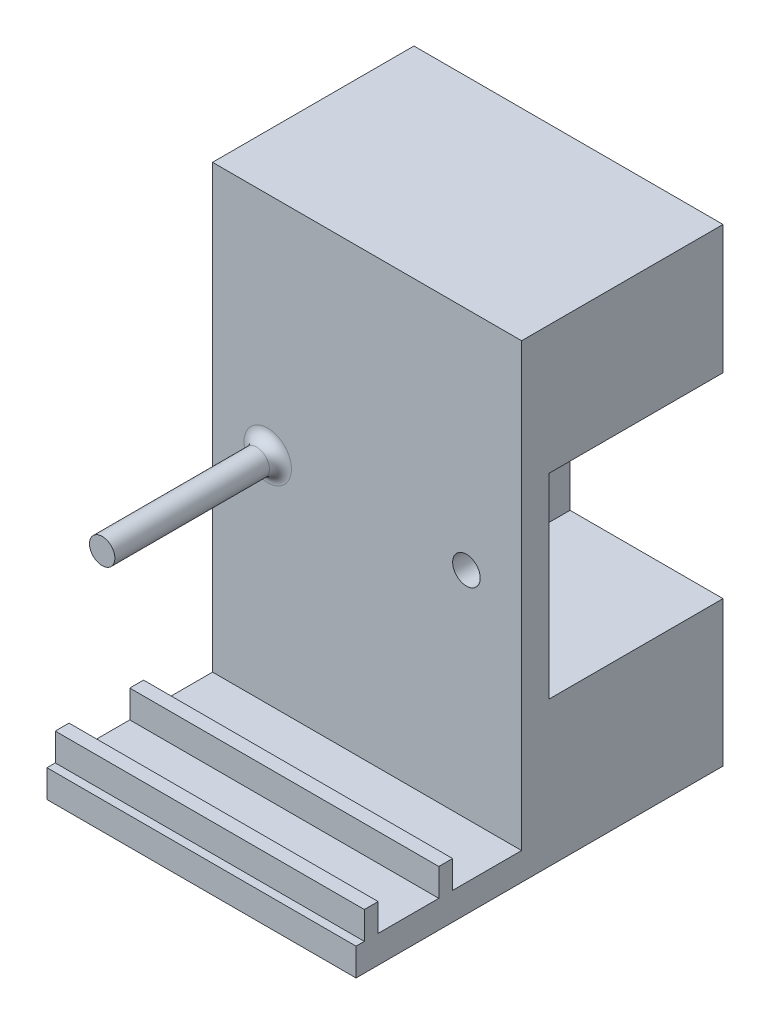
ISO-10303-21;
HEADER;
FILE_DESCRIPTION(('STEP AP214'),'2;1');
FILE_NAME('part.step','',(''),(''),'','','');
FILE_SCHEMA(('AUTOMOTIVE_DESIGN { 1 0 10303 214 1 1 1 1 }'));
ENDSEC;
DATA;
#1=APPLICATION_CONTEXT('core data for automotive mechanical design processes');
#2=APPLICATION_PROTOCOL_DEFINITION('international standard','automotive_design',2000,#1);
#3=PRODUCT_CONTEXT('',#1,'mechanical');
#4=PRODUCT('Part','Part','',(#3));
#5=PRODUCT_RELATED_PRODUCT_CATEGORY('part','',(#4));
#6=PRODUCT_DEFINITION_FORMATION('','',#4);
#7=PRODUCT_DEFINITION_CONTEXT('part definition',#1,'design');
#8=PRODUCT_DEFINITION('design','',#6,#7);
#9=PRODUCT_DEFINITION_SHAPE('','',#8);
#10=(LENGTH_UNIT() NAMED_UNIT(*) SI_UNIT(.MILLI.,.METRE.));
#11=(NAMED_UNIT(*) PLANE_ANGLE_UNIT() SI_UNIT($,.RADIAN.));
#12=(NAMED_UNIT(*) SI_UNIT($,.STERADIAN.) SOLID_ANGLE_UNIT());
#13=UNCERTAINTY_MEASURE_WITH_UNIT(LENGTH_MEASURE(1.E-05),#10,'distance_accuracy_value','');
#14=(GEOMETRIC_REPRESENTATION_CONTEXT(3) GLOBAL_UNCERTAINTY_ASSIGNED_CONTEXT((#13)) GLOBAL_UNIT_ASSIGNED_CONTEXT((#10,
#11,#12)) REPRESENTATION_CONTEXT('',''));
#15=CARTESIAN_POINT('',(0.,0.,0.));
#16=DIRECTION('',(0.,0.,1.));
#17=DIRECTION('',(1.,0.,0.));
#18=AXIS2_PLACEMENT_3D('',#15,#16,#17);
#19=CARTESIAN_POINT('',(-35.56,-50.8,-40.));
#20=DIRECTION('',(0.,-1.,0.));
#21=DIRECTION('',(0.,0.,-1.));
#22=AXIS2_PLACEMENT_3D('',#19,#20,#21);
#23=PLANE('',#22);
#24=DIRECTION('',(1.,0.,0.));
#25=VECTOR('',#24,1.);
#26=CARTESIAN_POINT('',(-35.5599999999996,-50.8,42.545));
#27=LINE('',#26,#25);
#28=CARTESIAN_POINT('',(-35.5599999999996,-50.8,42.545));
#29=VERTEX_POINT('',#28);
#30=CARTESIAN_POINT('',(35.56,-50.8,42.545));
#31=VERTEX_POINT('',#30);
#32=EDGE_CURVE('E365',#29,#31,#27,.T.);
#33=ORIENTED_EDGE('',*,*,#32,.F.);
#34=DIRECTION('',(0.,0.,1.));
#35=VECTOR('',#34,1.);
#36=CARTESIAN_POINT('',(-35.56,-50.8,-40.));
#37=LINE('',#36,#35);
#38=CARTESIAN_POINT('',(-35.56,-50.8,44.45));
#39=VERTEX_POINT('',#38);
#40=EDGE_CURVE('E185',#29,#39,#37,.T.);
#41=ORIENTED_EDGE('',*,*,#40,.T.);
#42=DIRECTION('',(1.,0.,0.));
#43=VECTOR('',#42,1.);
#44=CARTESIAN_POINT('',(-35.56,-50.8,44.45));
#45=LINE('',#44,#43);
#46=CARTESIAN_POINT('',(35.56,-50.8,44.45));
#47=VERTEX_POINT('',#46);
#48=EDGE_CURVE('E226',#39,#47,#45,.T.);
#49=ORIENTED_EDGE('',*,*,#48,.T.);
#50=DIRECTION('',(0.,0.,1.));
#51=VECTOR('',#50,1.);
#52=CARTESIAN_POINT('',(35.56,-50.8,-40.));
#53=LINE('',#52,#51);
#54=EDGE_CURVE('E240',#31,#47,#53,.T.);
#55=ORIENTED_EDGE('',*,*,#54,.F.);
#56=EDGE_LOOP('',(#33,#41,#49,#55));
#57=FACE_BOUND('',#56,.T.);
#58=ADVANCED_FACE('F38',(#57),#23,.F.);
#59=DIRECTION('',(-1.,0.,0.));
#60=VECTOR('',#59,1.);
#61=CARTESIAN_POINT('',(-35.5599999999996,-50.8,39.37));
#62=LINE('',#61,#60);
#63=CARTESIAN_POINT('',(35.56,-50.8,39.37));
#64=VERTEX_POINT('',#63);
#65=CARTESIAN_POINT('',(-35.5599999999996,-50.8,39.37));
#66=VERTEX_POINT('',#65);
#67=EDGE_CURVE('E180',#64,#66,#62,.T.);
#68=ORIENTED_EDGE('',*,*,#67,.F.);
#69=CARTESIAN_POINT('',(35.56,-50.8,25.4));
#70=VERTEX_POINT('',#69);
#71=EDGE_CURVE('E61',#70,#64,#53,.T.);
#72=ORIENTED_EDGE('',*,*,#71,.F.);
#73=DIRECTION('',(1.,0.,0.));
#74=VECTOR('',#73,1.);
#75=CARTESIAN_POINT('',(-35.56,-50.8,25.4));
#76=LINE('',#75,#74);
#77=CARTESIAN_POINT('',(-35.56,-50.8,25.4));
#78=VERTEX_POINT('',#77);
#79=EDGE_CURVE('E186',#78,#70,#76,.T.);
#80=ORIENTED_EDGE('',*,*,#79,.F.);
#81=EDGE_CURVE('E236',#78,#66,#37,.T.);
#82=ORIENTED_EDGE('',*,*,#81,.T.);
#83=EDGE_LOOP('',(#68,#72,#80,#82));
#84=FACE_BOUND('',#83,.T.);
#85=ADVANCED_FACE('F327',(#84),#23,.F.);
#86=DIRECTION('',(-1.,0.,0.));
#87=VECTOR('',#86,1.);
#88=CARTESIAN_POINT('',(-35.56,-50.8,22.225));
#89=LINE('',#88,#87);
#90=CARTESIAN_POINT('',(35.56,-50.8,22.225));
#91=VERTEX_POINT('',#90);
#92=CARTESIAN_POINT('',(-35.56,-50.8,22.225));
#93=VERTEX_POINT('',#92);
#94=EDGE_CURVE('E188',#91,#93,#89,.T.);
#95=ORIENTED_EDGE('',*,*,#94,.F.);
#96=CARTESIAN_POINT('',(35.56,-50.8,6.35));
#97=VERTEX_POINT('',#96);
#98=EDGE_CURVE('E237',#97,#91,#53,.T.);
#99=ORIENTED_EDGE('',*,*,#98,.F.);
#100=DIRECTION('',(1.,0.,0.));
#101=VECTOR('',#100,1.);
#102=CARTESIAN_POINT('',(-35.56,-50.8,6.35));
#103=LINE('',#102,#101);
#104=CARTESIAN_POINT('',(-35.56,-50.8,6.35));
#105=VERTEX_POINT('',#104);
#106=EDGE_CURVE('E296',#105,#97,#103,.T.);
#107=ORIENTED_EDGE('',*,*,#106,.F.);
#108=EDGE_CURVE('E233',#105,#93,#37,.T.);
#109=ORIENTED_EDGE('',*,*,#108,.T.);
#110=EDGE_LOOP('',(#95,#99,#107,#109));
#111=FACE_BOUND('',#110,.T.);
#112=ADVANCED_FACE('F330',(#111),#23,.F.);
#113=CARTESIAN_POINT('',(-35.56,50.8,6.35));
#114=DIRECTION('',(0.,1.,0.));
#115=DIRECTION('',(0.,0.,1.));
#116=AXIS2_PLACEMENT_3D('',#113,#114,#115);
#117=PLANE('',#116);
#118=DIRECTION('',(0.,0.,-1.));
#119=VECTOR('',#118,1.);
#120=CARTESIAN_POINT('',(35.56,50.8,6.35));
#121=LINE('',#120,#119);
#122=CARTESIAN_POINT('',(35.56,50.8,6.35));
#123=VERTEX_POINT('',#122);
#124=CARTESIAN_POINT('',(35.56,50.8,-40.));
#125=VERTEX_POINT('',#124);
#126=EDGE_CURVE('E302',#123,#125,#121,.T.);
#127=ORIENTED_EDGE('',*,*,#126,.T.);
#128=DIRECTION('',(1.,0.,0.));
#129=VECTOR('',#128,1.);
#130=CARTESIAN_POINT('',(0.,50.8,-40.));
#131=LINE('',#130,#129);
#132=CARTESIAN_POINT('',(-35.56,50.8,-40.));
#133=VERTEX_POINT('',#132);
#134=EDGE_CURVE('E262',#133,#125,#131,.T.);
#135=ORIENTED_EDGE('',*,*,#134,.F.);
#136=DIRECTION('',(0.,0.,-1.));
#137=VECTOR('',#136,1.);
#138=CARTESIAN_POINT('',(-35.56,50.8,6.35));
#139=LINE('',#138,#137);
#140=CARTESIAN_POINT('',(-35.56,50.8,6.35));
#141=VERTEX_POINT('',#140);
#142=EDGE_CURVE('E304',#141,#133,#139,.T.);
#143=ORIENTED_EDGE('',*,*,#142,.F.);
#144=DIRECTION('',(1.,0.,0.));
#145=VECTOR('',#144,1.);
#146=CARTESIAN_POINT('',(-35.56,50.8,6.35));
#147=LINE('',#146,#145);
#148=EDGE_CURVE('E290',#141,#123,#147,.T.);
#149=ORIENTED_EDGE('',*,*,#148,.T.);
#150=EDGE_LOOP('',(#127,#135,#143,#149));
#151=FACE_BOUND('',#150,.T.);
#152=ADVANCED_FACE('F336',(#151),#117,.T.);
#153=CARTESIAN_POINT('',(-35.56,50.8,6.35));
#154=DIRECTION('',(1.,0.,0.));
#155=DIRECTION('',(0.,1.,0.));
#156=AXIS2_PLACEMENT_3D('',#153,#154,#155);
#157=PLANE('',#156);
#158=ORIENTED_EDGE('',*,*,#142,.T.);
#159=DIRECTION('',(0.,1.,0.));
#160=VECTOR('',#159,1.);
#161=CARTESIAN_POINT('',(-35.56,0.,-40.));
#162=LINE('',#161,#160);
#163=CARTESIAN_POINT('',(-35.56,-57.15,-40.));
#164=VERTEX_POINT('',#163);
#165=EDGE_CURVE('E258',#164,#133,#162,.T.);
#166=ORIENTED_EDGE('',*,*,#165,.F.);
#167=DIRECTION('',(0.,0.,1.));
#168=VECTOR('',#167,1.);
#169=CARTESIAN_POINT('',(-35.56,-57.15,-40.));
#170=LINE('',#169,#168);
#171=CARTESIAN_POINT('',(-35.56,-57.15,44.45));
#172=VERTEX_POINT('',#171);
#173=EDGE_CURVE('E232',#164,#172,#170,.T.);
#174=ORIENTED_EDGE('',*,*,#173,.T.);
#175=DIRECTION('',(0.,-1.,0.));
#176=VECTOR('',#175,1.);
#177=CARTESIAN_POINT('',(-35.56,-50.8,44.45));
#178=LINE('',#177,#176);
#179=EDGE_CURVE('E217',#39,#172,#178,.T.);
#180=ORIENTED_EDGE('',*,*,#179,.F.);
#181=ORIENTED_EDGE('',*,*,#40,.F.);
#182=DIRECTION('',(0.,-1.,0.));
#183=VECTOR('',#182,1.);
#184=CARTESIAN_POINT('',(-35.5599999999996,-44.45,42.545));
#185=LINE('',#184,#183);
#186=CARTESIAN_POINT('',(-35.5599999999996,-44.45,42.545));
#187=VERTEX_POINT('',#186);
#188=EDGE_CURVE('E167',#187,#29,#185,.T.);
#189=ORIENTED_EDGE('',*,*,#188,.F.);
#190=DIRECTION('',(0.,0.,1.));
#191=VECTOR('',#190,1.);
#192=CARTESIAN_POINT('',(-35.5599999999996,-44.45,39.37));
#193=LINE('',#192,#191);
#194=CARTESIAN_POINT('',(-35.5599999999996,-44.45,39.37));
#195=VERTEX_POINT('',#194);
#196=EDGE_CURVE('E171',#195,#187,#193,.T.);
#197=ORIENTED_EDGE('',*,*,#196,.F.);
#198=DIRECTION('',(0.,-1.,0.));
#199=VECTOR('',#198,1.);
#200=CARTESIAN_POINT('',(-35.5599999999996,-44.45,39.37));
#201=LINE('',#200,#199);
#202=EDGE_CURVE('E362',#195,#66,#201,.T.);
#203=ORIENTED_EDGE('',*,*,#202,.T.);
#204=ORIENTED_EDGE('',*,*,#81,.F.);
#205=DIRECTION('',(0.,-1.,0.));
#206=VECTOR('',#205,1.);
#207=CARTESIAN_POINT('',(-35.56,-44.45,25.4));
#208=LINE('',#207,#206);
#209=CARTESIAN_POINT('',(-35.56,-44.45,25.4));
#210=VERTEX_POINT('',#209);
#211=EDGE_CURVE('E214',#210,#78,#208,.T.);
#212=ORIENTED_EDGE('',*,*,#211,.F.);
#213=DIRECTION('',(0.,0.,1.));
#214=VECTOR('',#213,1.);
#215=CARTESIAN_POINT('',(-35.56,-44.45,22.225));
#216=LINE('',#215,#214);
#217=CARTESIAN_POINT('',(-35.56,-44.45,22.225));
#218=VERTEX_POINT('',#217);
#219=EDGE_CURVE('E194',#218,#210,#216,.T.);
#220=ORIENTED_EDGE('',*,*,#219,.F.);
#221=DIRECTION('',(0.,-1.,0.));
#222=VECTOR('',#221,1.);
#223=CARTESIAN_POINT('',(-35.56,-44.45,22.225));
#224=LINE('',#223,#222);
#225=EDGE_CURVE('E202',#218,#93,#224,.T.);
#226=ORIENTED_EDGE('',*,*,#225,.T.);
#227=ORIENTED_EDGE('',*,*,#108,.F.);
#228=DIRECTION('',(0.,-1.,0.));
#229=VECTOR('',#228,1.);
#230=CARTESIAN_POINT('',(-35.56,50.8,6.35));
#231=LINE('',#230,#229);
#232=EDGE_CURVE('E299',#141,#105,#231,.T.);
#233=ORIENTED_EDGE('',*,*,#232,.F.);
#234=EDGE_LOOP('',(#158,#166,#174,#180,#181,#189,#197,#203,#204,#212,#220,#226,#227,#233));
#235=FACE_BOUND('',#234,.T.);
#236=ADVANCED_FACE('F183',(#235),#157,.F.);
#237=CARTESIAN_POINT('',(35.56,50.8,6.35));
#238=DIRECTION('',(1.,0.,0.));
#239=DIRECTION('',(0.,1.,0.));
#240=AXIS2_PLACEMENT_3D('',#237,#238,#239);
#241=PLANE('',#240);
#242=DIRECTION('',(0.,-1.,0.));
#243=VECTOR('',#242,1.);
#244=CARTESIAN_POINT('',(35.56,50.8,0.));
#245=LINE('',#244,#243);
#246=CARTESIAN_POINT('',(35.56,21.23,0.));
#247=VERTEX_POINT('',#246);
#248=CARTESIAN_POINT('',(35.56,-23.77,0.));
#249=VERTEX_POINT('',#248);
#250=EDGE_CURVE('E287',#247,#249,#245,.T.);
#251=ORIENTED_EDGE('',*,*,#250,.F.);
#252=DIRECTION('',(0.,0.,1.));
#253=VECTOR('',#252,1.);
#254=CARTESIAN_POINT('',(35.56,21.23,-40.));
#255=LINE('',#254,#253);
#256=CARTESIAN_POINT('',(35.56,21.23,-40.));
#257=VERTEX_POINT('',#256);
#258=EDGE_CURVE('E271',#257,#247,#255,.T.);
#259=ORIENTED_EDGE('',*,*,#258,.F.);
#260=DIRECTION('',(0.,-1.,0.));
#261=VECTOR('',#260,1.);
#262=CARTESIAN_POINT('',(35.56,0.,-40.));
#263=LINE('',#262,#261);
#264=EDGE_CURVE('E259',#125,#257,#263,.T.);
#265=ORIENTED_EDGE('',*,*,#264,.F.);
#266=ORIENTED_EDGE('',*,*,#126,.F.);
#267=DIRECTION('',(0.,-1.,0.));
#268=VECTOR('',#267,1.);
#269=CARTESIAN_POINT('',(35.56,50.8,6.35));
#270=LINE('',#269,#268);
#271=EDGE_CURVE('E293',#123,#97,#270,.T.);
#272=ORIENTED_EDGE('',*,*,#271,.T.);
#273=ORIENTED_EDGE('',*,*,#98,.T.);
#274=DIRECTION('',(0.,-1.,0.));
#275=VECTOR('',#274,1.);
#276=CARTESIAN_POINT('',(35.56,-44.45,22.225));
#277=LINE('',#276,#275);
#278=CARTESIAN_POINT('',(35.56,-44.45,22.225));
#279=VERTEX_POINT('',#278);
#280=EDGE_CURVE('E208',#279,#91,#277,.T.);
#281=ORIENTED_EDGE('',*,*,#280,.F.);
#282=DIRECTION('',(0.,0.,-1.));
#283=VECTOR('',#282,1.);
#284=CARTESIAN_POINT('',(35.56,-44.45,22.225));
#285=LINE('',#284,#283);
#286=CARTESIAN_POINT('',(35.56,-44.45,25.4));
#287=VERTEX_POINT('',#286);
#288=EDGE_CURVE('E199',#287,#279,#285,.T.);
#289=ORIENTED_EDGE('',*,*,#288,.F.);
#290=DIRECTION('',(0.,-1.,0.));
#291=VECTOR('',#290,1.);
#292=CARTESIAN_POINT('',(35.56,-44.45,25.4));
#293=LINE('',#292,#291);
#294=EDGE_CURVE('E211',#287,#70,#293,.T.);
#295=ORIENTED_EDGE('',*,*,#294,.T.);
#296=ORIENTED_EDGE('',*,*,#71,.T.);
#297=DIRECTION('',(0.,-1.,0.));
#298=VECTOR('',#297,1.);
#299=CARTESIAN_POINT('',(35.56,-44.45,39.37));
#300=LINE('',#299,#298);
#301=CARTESIAN_POINT('',(35.56,-44.45,39.37));
#302=VERTEX_POINT('',#301);
#303=EDGE_CURVE('E190',#302,#64,#300,.T.);
#304=ORIENTED_EDGE('',*,*,#303,.F.);
#305=DIRECTION('',(0.,0.,-1.));
#306=VECTOR('',#305,1.);
#307=CARTESIAN_POINT('',(35.56,-44.45,39.37));
#308=LINE('',#307,#306);
#309=CARTESIAN_POINT('',(35.56,-44.45,42.545));
#310=VERTEX_POINT('',#309);
#311=EDGE_CURVE('E170',#310,#302,#308,.T.);
#312=ORIENTED_EDGE('',*,*,#311,.F.);
#313=DIRECTION('',(0.,-1.,0.));
#314=VECTOR('',#313,1.);
#315=CARTESIAN_POINT('',(35.56,-44.45,42.545));
#316=LINE('',#315,#314);
#317=EDGE_CURVE('E53',#310,#31,#316,.T.);
#318=ORIENTED_EDGE('',*,*,#317,.T.);
#319=ORIENTED_EDGE('',*,*,#54,.T.);
#320=DIRECTION('',(0.,-1.,0.));
#321=VECTOR('',#320,1.);
#322=CARTESIAN_POINT('',(35.56,-50.8,44.45));
#323=LINE('',#322,#321);
#324=CARTESIAN_POINT('',(35.56,-57.15,44.45));
#325=VERTEX_POINT('',#324);
#326=EDGE_CURVE('E223',#47,#325,#323,.T.);
#327=ORIENTED_EDGE('',*,*,#326,.T.);
#328=DIRECTION('',(0.,0.,1.));
#329=VECTOR('',#328,1.);
#330=CARTESIAN_POINT('',(35.56,-57.15,-40.));
#331=LINE('',#330,#329);
#332=CARTESIAN_POINT('',(35.56,-57.15,-40.));
#333=VERTEX_POINT('',#332);
#334=EDGE_CURVE('E241',#333,#325,#331,.T.);
#335=ORIENTED_EDGE('',*,*,#334,.F.);
#336=CARTESIAN_POINT('',(35.56,-23.77,-40.));
#337=VERTEX_POINT('',#336);
#338=EDGE_CURVE('E256',#337,#333,#263,.T.);
#339=ORIENTED_EDGE('',*,*,#338,.F.);
#340=DIRECTION('',(0.,0.,1.));
#341=VECTOR('',#340,1.);
#342=CARTESIAN_POINT('',(35.56,-23.77,-40.));
#343=LINE('',#342,#341);
#344=EDGE_CURVE('E274',#337,#249,#343,.T.);
#345=ORIENTED_EDGE('',*,*,#344,.T.);
#346=EDGE_LOOP('',(#251,#259,#265,#266,#272,#273,#281,#289,#295,#296,#304,#312,#318,#319,#327,
#335,#339,#345));
#347=FACE_BOUND('',#346,.T.);
#348=ADVANCED_FACE('F347',(#347),#241,.T.);
#349=CARTESIAN_POINT('',(0.,0.,6.35));
#350=DIRECTION('',(0.,0.,-1.));
#351=DIRECTION('',(-1.,0.,0.));
#352=AXIS2_PLACEMENT_3D('',#349,#350,#351);
#353=PLANE('',#352);
#354=CARTESIAN_POINT('',(-22.86,-1.27000000000001,6.35));
#355=DIRECTION('',(0.,0.,-1.));
#356=DIRECTION('',(-1.,0.,0.));
#357=AXIS2_PLACEMENT_3D('',#354,#355,#356);
#358=CIRCLE('',#357,5.461);
#359=CARTESIAN_POINT('',(-28.321,-1.27000000000001,6.35));
#360=VERTEX_POINT('',#359);
#361=EDGE_CURVE('E11',#360,#360,#358,.T.);
#362=ORIENTED_EDGE('',*,*,#361,.T.);
#363=EDGE_LOOP('',(#362));
#364=FACE_BOUND('',#363,.T.);
#365=CARTESIAN_POINT('',(22.86,-1.27000000000001,6.35));
#366=DIRECTION('',(0.,0.,1.));
#367=DIRECTION('',(1.,0.,0.));
#368=AXIS2_PLACEMENT_3D('',#365,#366,#367);
#369=CIRCLE('',#368,3.175);
#370=CARTESIAN_POINT('',(26.035,-1.27000000000001,6.35));
#371=VERTEX_POINT('',#370);
#372=EDGE_CURVE('E283',#371,#371,#369,.T.);
#373=ORIENTED_EDGE('',*,*,#372,.F.);
#374=EDGE_LOOP('',(#373));
#375=FACE_BOUND('',#374,.T.);
#376=ORIENTED_EDGE('',*,*,#148,.F.);
#377=ORIENTED_EDGE('',*,*,#232,.T.);
#378=ORIENTED_EDGE('',*,*,#106,.T.);
#379=ORIENTED_EDGE('',*,*,#271,.F.);
#380=EDGE_LOOP('',(#376,#377,#378,#379));
#381=FACE_BOUND('',#380,.T.);
#382=ADVANCED_FACE('F390',(#364,#375,#381),#353,.F.);
#383=CARTESIAN_POINT('',(0.,0.,0.));
#384=DIRECTION('',(0.,0.,-1.));
#385=DIRECTION('',(-1.,0.,0.));
#386=AXIS2_PLACEMENT_3D('',#383,#384,#385);
#387=PLANE('',#386);
#388=DIRECTION('',(-1.,0.,0.));
#389=VECTOR('',#388,1.);
#390=CARTESIAN_POINT('',(0.,21.23,0.));
#391=LINE('',#390,#389);
#392=CARTESIAN_POINT('',(0.359999999999996,21.23,0.));
#393=VERTEX_POINT('',#392);
#394=EDGE_CURVE('E246',#247,#393,#391,.T.);
#395=ORIENTED_EDGE('',*,*,#394,.F.);
#396=ORIENTED_EDGE('',*,*,#250,.T.);
#397=DIRECTION('',(-1.,0.,0.));
#398=VECTOR('',#397,1.);
#399=CARTESIAN_POINT('',(0.,-23.77,0.));
#400=LINE('',#399,#398);
#401=CARTESIAN_POINT('',(0.35999999999999,-23.77,0.));
#402=VERTEX_POINT('',#401);
#403=EDGE_CURVE('E251',#249,#402,#400,.T.);
#404=ORIENTED_EDGE('',*,*,#403,.T.);
#405=DIRECTION('',(0.,-1.,0.));
#406=VECTOR('',#405,1.);
#407=CARTESIAN_POINT('',(0.359999999999993,0.,0.));
#408=LINE('',#407,#406);
#409=EDGE_CURVE('E267',#393,#402,#408,.T.);
#410=ORIENTED_EDGE('',*,*,#409,.F.);
#411=EDGE_LOOP('',(#395,#396,#404,#410));
#412=FACE_BOUND('',#411,.T.);
#413=CARTESIAN_POINT('',(22.86,-1.27000000000001,0.));
#414=DIRECTION('',(0.,0.,1.));
#415=DIRECTION('',(1.,0.,0.));
#416=AXIS2_PLACEMENT_3D('',#413,#414,#415);
#417=CIRCLE('',#416,3.175);
#418=CARTESIAN_POINT('',(26.035,-1.27000000000001,0.));
#419=VERTEX_POINT('',#418);
#420=EDGE_CURVE('E284',#419,#419,#417,.T.);
#421=ORIENTED_EDGE('',*,*,#420,.T.);
#422=EDGE_LOOP('',(#421));
#423=FACE_BOUND('',#422,.T.);
#424=ADVANCED_FACE('F393',(#412,#423),#387,.T.);
#425=CARTESIAN_POINT('',(22.86,-1.27000000000001,0.));
#426=DIRECTION('',(0.,0.,1.));
#427=DIRECTION('',(1.,0.,0.));
#428=AXIS2_PLACEMENT_3D('',#425,#426,#427);
#429=CYLINDRICAL_SURFACE('',#428,3.175);
#430=ORIENTED_EDGE('',*,*,#420,.F.);
#431=EDGE_LOOP('',(#430));
#432=FACE_BOUND('',#431,.T.);
#433=ORIENTED_EDGE('',*,*,#372,.T.);
#434=EDGE_LOOP('',(#433));
#435=FACE_BOUND('',#434,.T.);
#436=ADVANCED_FACE('F400',(#432,#435),#429,.F.);
#437=CARTESIAN_POINT('',(0.,21.23,-40.));
#438=DIRECTION('',(0.,1.,0.));
#439=DIRECTION('',(0.,0.,1.));
#440=AXIS2_PLACEMENT_3D('',#437,#438,#439);
#441=PLANE('',#440);
#442=ORIENTED_EDGE('',*,*,#394,.T.);
#443=DIRECTION('',(0.,0.,1.));
#444=VECTOR('',#443,1.);
#445=CARTESIAN_POINT('',(0.359999999999996,21.23,-40.));
#446=LINE('',#445,#444);
#447=CARTESIAN_POINT('',(0.359999999999996,21.23,-40.));
#448=VERTEX_POINT('',#447);
#449=EDGE_CURVE('E280',#448,#393,#446,.T.);
#450=ORIENTED_EDGE('',*,*,#449,.F.);
#451=DIRECTION('',(-1.,0.,0.));
#452=VECTOR('',#451,1.);
#453=CARTESIAN_POINT('',(0.,21.23,-40.));
#454=LINE('',#453,#452);
#455=EDGE_CURVE('E247',#257,#448,#454,.T.);
#456=ORIENTED_EDGE('',*,*,#455,.F.);
#457=ORIENTED_EDGE('',*,*,#258,.T.);
#458=EDGE_LOOP('',(#442,#450,#456,#457));
#459=FACE_BOUND('',#458,.T.);
#460=ADVANCED_FACE('F386',(#459),#441,.F.);
#461=CARTESIAN_POINT('',(0.359999999999993,0.,-40.));
#462=DIRECTION('',(-1.,0.,0.));
#463=DIRECTION('',(0.,-1.,0.));
#464=AXIS2_PLACEMENT_3D('',#461,#462,#463);
#465=PLANE('',#464);
#466=ORIENTED_EDGE('',*,*,#409,.T.);
#467=DIRECTION('',(0.,0.,1.));
#468=VECTOR('',#467,1.);
#469=CARTESIAN_POINT('',(0.35999999999999,-23.77,-40.));
#470=LINE('',#469,#468);
#471=CARTESIAN_POINT('',(0.35999999999999,-23.77,-40.));
#472=VERTEX_POINT('',#471);
#473=EDGE_CURVE('E277',#472,#402,#470,.T.);
#474=ORIENTED_EDGE('',*,*,#473,.F.);
#475=DIRECTION('',(0.,-1.,0.));
#476=VECTOR('',#475,1.);
#477=CARTESIAN_POINT('',(0.359999999999993,0.,-40.));
#478=LINE('',#477,#476);
#479=EDGE_CURVE('E250',#448,#472,#478,.T.);
#480=ORIENTED_EDGE('',*,*,#479,.F.);
#481=ORIENTED_EDGE('',*,*,#449,.T.);
#482=EDGE_LOOP('',(#466,#474,#480,#481));
#483=FACE_BOUND('',#482,.T.);
#484=ADVANCED_FACE('F522',(#483),#465,.F.);
#485=CARTESIAN_POINT('',(0.,-23.77,-40.));
#486=DIRECTION('',(0.,1.,0.));
#487=DIRECTION('',(0.,0.,1.));
#488=AXIS2_PLACEMENT_3D('',#485,#486,#487);
#489=PLANE('',#488);
#490=ORIENTED_EDGE('',*,*,#403,.F.);
#491=ORIENTED_EDGE('',*,*,#344,.F.);
#492=DIRECTION('',(-1.,0.,0.));
#493=VECTOR('',#492,1.);
#494=CARTESIAN_POINT('',(0.,-23.77,-40.));
#495=LINE('',#494,#493);
#496=EDGE_CURVE('E253',#337,#472,#495,.T.);
#497=ORIENTED_EDGE('',*,*,#496,.T.);
#498=ORIENTED_EDGE('',*,*,#473,.T.);
#499=EDGE_LOOP('',(#490,#491,#497,#498));
#500=FACE_BOUND('',#499,.T.);
#501=ADVANCED_FACE('F380',(#500),#489,.T.);
#502=CARTESIAN_POINT('',(0.,0.,-40.));
#503=DIRECTION('',(0.,0.,-1.));
#504=DIRECTION('',(-1.,0.,0.));
#505=AXIS2_PLACEMENT_3D('',#502,#503,#504);
#506=PLANE('',#505);
#507=ORIENTED_EDGE('',*,*,#455,.T.);
#508=ORIENTED_EDGE('',*,*,#479,.T.);
#509=ORIENTED_EDGE('',*,*,#496,.F.);
#510=ORIENTED_EDGE('',*,*,#338,.T.);
#511=DIRECTION('',(1.,0.,0.));
#512=VECTOR('',#511,1.);
#513=CARTESIAN_POINT('',(-35.56,-57.15,-40.));
#514=LINE('',#513,#512);
#515=EDGE_CURVE('E229',#164,#333,#514,.T.);
#516=ORIENTED_EDGE('',*,*,#515,.F.);
#517=ORIENTED_EDGE('',*,*,#165,.T.);
#518=ORIENTED_EDGE('',*,*,#134,.T.);
#519=ORIENTED_EDGE('',*,*,#264,.T.);
#520=EDGE_LOOP('',(#507,#508,#509,#510,#516,#517,#518,#519));
#521=FACE_BOUND('',#520,.T.);
#522=ADVANCED_FACE('F375',(#521),#506,.T.);
#523=CARTESIAN_POINT('',(-22.86,-1.27000000000001,44.45));
#524=DIRECTION('',(0.,0.,-1.));
#525=DIRECTION('',(-1.,0.,0.));
#526=AXIS2_PLACEMENT_3D('',#523,#524,#525);
#527=CYLINDRICAL_SURFACE('',#526,2.921);
#528=CARTESIAN_POINT('',(-22.86,-1.27000000000001,8.89000000000001));
#529=DIRECTION('',(0.,0.,-1.));
#530=DIRECTION('',(-1.,0.,0.));
#531=AXIS2_PLACEMENT_3D('',#528,#529,#530);
#532=CIRCLE('',#531,2.921);
#533=CARTESIAN_POINT('',(-25.781,-1.27000000000001,8.89000000000002));
#534=VERTEX_POINT('',#533);
#535=EDGE_CURVE('E46',#534,#534,#532,.F.);
#536=CARTESIAN_POINT('',(-22.86,-1.27000000000001,44.45));
#537=DIRECTION('',(0.,0.,1.));
#538=DIRECTION('',(1.,0.,0.));
#539=AXIS2_PLACEMENT_3D('',#536,#537,#538);
#540=CIRCLE('',#539,2.921);
#541=CARTESIAN_POINT('',(-25.781,-1.27000000000001,44.45));
#542=VERTEX_POINT('',#541);
#543=EDGE_CURVE('E235',#542,#542,#540,.T.);
#544=CARTESIAN_POINT('',(-25.781,-1.27000000000001,8.89000000000002));
#545=CARTESIAN_POINT('',(-25.781,-1.27000000000001,9.26041666666668));
#546=CARTESIAN_POINT('',(-25.781,-1.27000000000001,9.63083333333335));
#547=CARTESIAN_POINT('',(-25.781,-1.27000000000001,10.3716666666667));
#548=CARTESIAN_POINT('',(-25.781,-1.27000000000001,10.7420833333334));
#549=CARTESIAN_POINT('',(-25.781,-1.27000000000001,11.4829166666667));
#550=CARTESIAN_POINT('',(-25.781,-1.27000000000001,11.8533333333333));
#551=CARTESIAN_POINT('',(-25.781,-1.27000000000001,12.5941666666667));
#552=CARTESIAN_POINT('',(-25.781,-1.27000000000001,12.9645833333333));
#553=CARTESIAN_POINT('',(-25.781,-1.27000000000001,13.7054166666667));
#554=CARTESIAN_POINT('',(-25.781,-1.27000000000001,14.0758333333333));
#555=CARTESIAN_POINT('',(-25.781,-1.27000000000001,14.8166666666667));
#556=CARTESIAN_POINT('',(-25.781,-1.27000000000001,15.1870833333333));
#557=CARTESIAN_POINT('',(-25.781,-1.27000000000001,15.9279166666667));
#558=CARTESIAN_POINT('',(-25.781,-1.27000000000001,16.2983333333333));
#559=CARTESIAN_POINT('',(-25.781,-1.27000000000001,17.0391666666667));
#560=CARTESIAN_POINT('',(-25.781,-1.27000000000001,17.4095833333333));
#561=CARTESIAN_POINT('',(-25.781,-1.27000000000001,18.1504166666667));
#562=CARTESIAN_POINT('',(-25.781,-1.27000000000001,18.5208333333333));
#563=CARTESIAN_POINT('',(-25.781,-1.27000000000001,19.2616666666667));
#564=CARTESIAN_POINT('',(-25.781,-1.27000000000001,19.6320833333333));
#565=CARTESIAN_POINT('',(-25.781,-1.27000000000001,20.3729166666667));
#566=CARTESIAN_POINT('',(-25.781,-1.27000000000001,20.7433333333333));
#567=CARTESIAN_POINT('',(-25.781,-1.27000000000001,21.4841666666667));
#568=CARTESIAN_POINT('',(-25.781,-1.27000000000001,21.8545833333333));
#569=CARTESIAN_POINT('',(-25.781,-1.27000000000001,22.5954166666667));
#570=CARTESIAN_POINT('',(-25.781,-1.27000000000001,22.9658333333333));
#571=CARTESIAN_POINT('',(-25.781,-1.27000000000001,23.7066666666667));
#572=CARTESIAN_POINT('',(-25.781,-1.27000000000001,24.0770833333333));
#573=CARTESIAN_POINT('',(-25.781,-1.27000000000001,24.8179166666667));
#574=CARTESIAN_POINT('',(-25.781,-1.27000000000001,25.1883333333333));
#575=CARTESIAN_POINT('',(-25.781,-1.27000000000001,25.9291666666667));
#576=CARTESIAN_POINT('',(-25.781,-1.27000000000001,26.2995833333333));
#577=CARTESIAN_POINT('',(-25.781,-1.27000000000001,27.0404166666667));
#578=CARTESIAN_POINT('',(-25.781,-1.27000000000001,27.4108333333333));
#579=CARTESIAN_POINT('',(-25.781,-1.27000000000001,28.1516666666667));
#580=CARTESIAN_POINT('',(-25.781,-1.27000000000001,28.5220833333333));
#581=CARTESIAN_POINT('',(-25.781,-1.27000000000001,29.2629166666667));
#582=CARTESIAN_POINT('',(-25.781,-1.27000000000001,29.6333333333333));
#583=CARTESIAN_POINT('',(-25.781,-1.27000000000001,30.3741666666667));
#584=CARTESIAN_POINT('',(-25.781,-1.27000000000001,30.7445833333333));
#585=CARTESIAN_POINT('',(-25.781,-1.27000000000001,31.4854166666667));
#586=CARTESIAN_POINT('',(-25.781,-1.27000000000001,31.8558333333333));
#587=CARTESIAN_POINT('',(-25.781,-1.27000000000001,32.5966666666667));
#588=CARTESIAN_POINT('',(-25.781,-1.27000000000001,32.9670833333333));
#589=CARTESIAN_POINT('',(-25.781,-1.27000000000001,33.7079166666667));
#590=CARTESIAN_POINT('',(-25.781,-1.27000000000001,34.0783333333333));
#591=CARTESIAN_POINT('',(-25.781,-1.27000000000001,34.8191666666667));
#592=CARTESIAN_POINT('',(-25.781,-1.27000000000001,35.1895833333333));
#593=CARTESIAN_POINT('',(-25.781,-1.27000000000001,35.9304166666667));
#594=CARTESIAN_POINT('',(-25.781,-1.27000000000001,36.3008333333333));
#595=CARTESIAN_POINT('',(-25.781,-1.27000000000001,37.0416666666667));
#596=CARTESIAN_POINT('',(-25.781,-1.27000000000001,37.4120833333333));
#597=CARTESIAN_POINT('',(-25.781,-1.27000000000001,38.1529166666667));
#598=CARTESIAN_POINT('',(-25.781,-1.27000000000001,38.5233333333333));
#599=CARTESIAN_POINT('',(-25.781,-1.27000000000001,39.2641666666667));
#600=CARTESIAN_POINT('',(-25.781,-1.27000000000001,39.6345833333333));
#601=CARTESIAN_POINT('',(-25.781,-1.27000000000001,40.3754166666667));
#602=CARTESIAN_POINT('',(-25.781,-1.27000000000001,40.7458333333333));
#603=CARTESIAN_POINT('',(-25.781,-1.27000000000001,41.4866666666667));
#604=CARTESIAN_POINT('',(-25.781,-1.27000000000001,41.8570833333333));
#605=CARTESIAN_POINT('',(-25.781,-1.27000000000001,42.5979166666667));
#606=CARTESIAN_POINT('',(-25.781,-1.27000000000001,42.9683333333333));
#607=CARTESIAN_POINT('',(-25.781,-1.27000000000001,43.7091666666667));
#608=CARTESIAN_POINT('',(-25.781,-1.27000000000001,44.0795833333333));
#609=CARTESIAN_POINT('',(-25.781,-1.27000000000001,44.45));
#610=B_SPLINE_CURVE_WITH_KNOTS('',3,(#544,#545,#546,#547,#548,#549,#550,#551,#552,#553,#554,
#555,#556,#557,#558,#559,#560,#561,#562,#563,#564,#565,#566,#567,#568,#569,#570,#571,#572,#573,
#574,#575,#576,#577,#578,#579,#580,#581,#582,#583,#584,#585,#586,#587,#588,#589,#590,#591,#592,
#593,#594,#595,#596,#597,#598,#599,#600,#601,#602,#603,#604,#605,#606,#607,#608,#609),
.UNSPECIFIED.,.F.,.F.,(4,2,2,2,2,2,2,2,2,2,2,2,2,2,2,2,2,2,2,2,2,2,2,2,2,2,2,2,2,2,2,2,4),(0.,
1.11125,2.2225,3.33375,4.44499999999999,5.55625,6.6675,7.77874999999999,8.88999999999999,
10.00125,11.1125,12.22375,13.335,14.44625,15.5575,16.66875,17.78,18.89125,20.0025,21.11375,
22.225,23.33625,24.4475,25.55875,26.67,27.78125,28.8925,30.00375,31.115,32.22625,33.3375,
34.44875,35.56),.UNSPECIFIED.);
#611=EDGE_CURVE('BSEAM309',#534,#542,#610,.T.);
#612=ORIENTED_EDGE('',*,*,#535,.T.);
#613=ORIENTED_EDGE('',*,*,#543,.F.);
#614=ORIENTED_EDGE('',*,*,#611,.T.);
#615=ORIENTED_EDGE('',*,*,#611,.F.);
#616=EDGE_LOOP('',(#612,#614,#613,#615));
#617=FACE_BOUND('',#616,.T.);
#618=ADVANCED_FACE('F309',(#617),#527,.T.);
#619=CARTESIAN_POINT('',(-22.86,-1.27000000000001,44.45));
#620=DIRECTION('',(0.,0.,1.));
#621=DIRECTION('',(1.,0.,0.));
#622=AXIS2_PLACEMENT_3D('',#619,#620,#621);
#623=PLANE('',#622);
#624=ORIENTED_EDGE('',*,*,#543,.T.);
#625=EDGE_LOOP('',(#624));
#626=FACE_BOUND('',#625,.T.);
#627=ADVANCED_FACE('F314',(#626),#623,.T.);
#628=CARTESIAN_POINT('',(-22.86,-1.27000000000001,8.89));
#629=DIRECTION('',(0.,0.,-1.));
#630=DIRECTION('',(-1.,0.,0.));
#631=AXIS2_PLACEMENT_3D('',#628,#629,#630);
#632=TOROIDAL_SURFACE('',#631,5.461,2.54);
#633=ORIENTED_EDGE('',*,*,#361,.F.);
#634=EDGE_LOOP('',(#633));
#635=FACE_BOUND('',#634,.T.);
#636=ORIENTED_EDGE('',*,*,#535,.F.);
#637=EDGE_LOOP('',(#636));
#638=FACE_BOUND('',#637,.T.);
#639=ADVANCED_FACE('F40',(#635,#638),#632,.F.);
#640=CARTESIAN_POINT('',(-35.56,-57.15,-40.));
#641=DIRECTION('',(0.,-1.,0.));
#642=DIRECTION('',(0.,0.,-1.));
#643=AXIS2_PLACEMENT_3D('',#640,#641,#642);
#644=PLANE('',#643);
#645=ORIENTED_EDGE('',*,*,#334,.T.);
#646=DIRECTION('',(1.,0.,0.));
#647=VECTOR('',#646,1.);
#648=CARTESIAN_POINT('',(-35.56,-57.15,44.45));
#649=LINE('',#648,#647);
#650=EDGE_CURVE('E220',#172,#325,#649,.T.);
#651=ORIENTED_EDGE('',*,*,#650,.F.);
#652=ORIENTED_EDGE('',*,*,#173,.F.);
#653=ORIENTED_EDGE('',*,*,#515,.T.);
#654=EDGE_LOOP('',(#645,#651,#652,#653));
#655=FACE_BOUND('',#654,.T.);
#656=ADVANCED_FACE('F313',(#655),#644,.T.);
#657=CARTESIAN_POINT('',(0.,0.,44.45));
#658=DIRECTION('',(0.,0.,1.));
#659=DIRECTION('',(1.,0.,0.));
#660=AXIS2_PLACEMENT_3D('',#657,#658,#659);
#661=PLANE('',#660);
#662=ORIENTED_EDGE('',*,*,#179,.T.);
#663=ORIENTED_EDGE('',*,*,#650,.T.);
#664=ORIENTED_EDGE('',*,*,#326,.F.);
#665=ORIENTED_EDGE('',*,*,#48,.F.);
#666=EDGE_LOOP('',(#662,#663,#664,#665));
#667=FACE_BOUND('',#666,.T.);
#668=ADVANCED_FACE('F320',(#667),#661,.T.);
#669=CARTESIAN_POINT('',(-35.56,-44.45,25.4));
#670=DIRECTION('',(0.,0.,-1.));
#671=DIRECTION('',(-1.,0.,0.));
#672=AXIS2_PLACEMENT_3D('',#669,#670,#671);
#673=PLANE('',#672);
#674=ORIENTED_EDGE('',*,*,#79,.T.);
#675=ORIENTED_EDGE('',*,*,#294,.F.);
#676=DIRECTION('',(1.,0.,0.));
#677=VECTOR('',#676,1.);
#678=CARTESIAN_POINT('',(-35.56,-44.45,25.4));
#679=LINE('',#678,#677);
#680=EDGE_CURVE('E197',#210,#287,#679,.T.);
#681=ORIENTED_EDGE('',*,*,#680,.F.);
#682=ORIENTED_EDGE('',*,*,#211,.T.);
#683=EDGE_LOOP('',(#674,#675,#681,#682));
#684=FACE_BOUND('',#683,.T.);
#685=ADVANCED_FACE('F359',(#684),#673,.F.);
#686=CARTESIAN_POINT('',(-35.56,-44.45,22.225));
#687=DIRECTION('',(0.,0.,1.));
#688=DIRECTION('',(1.,0.,0.));
#689=AXIS2_PLACEMENT_3D('',#686,#687,#688);
#690=PLANE('',#689);
#691=ORIENTED_EDGE('',*,*,#94,.T.);
#692=ORIENTED_EDGE('',*,*,#225,.F.);
#693=DIRECTION('',(-1.,0.,0.));
#694=VECTOR('',#693,1.);
#695=CARTESIAN_POINT('',(-35.56,-44.45,22.225));
#696=LINE('',#695,#694);
#697=EDGE_CURVE('E201',#279,#218,#696,.T.);
#698=ORIENTED_EDGE('',*,*,#697,.F.);
#699=ORIENTED_EDGE('',*,*,#280,.T.);
#700=EDGE_LOOP('',(#691,#692,#698,#699));
#701=FACE_BOUND('',#700,.T.);
#702=ADVANCED_FACE('F351',(#701),#690,.F.);
#703=CARTESIAN_POINT('',(0.,-44.45,0.));
#704=DIRECTION('',(0.,1.,0.));
#705=DIRECTION('',(0.,0.,1.));
#706=AXIS2_PLACEMENT_3D('',#703,#704,#705);
#707=PLANE('',#706);
#708=ORIENTED_EDGE('',*,*,#219,.T.);
#709=ORIENTED_EDGE('',*,*,#680,.T.);
#710=ORIENTED_EDGE('',*,*,#288,.T.);
#711=ORIENTED_EDGE('',*,*,#697,.T.);
#712=EDGE_LOOP('',(#708,#709,#710,#711));
#713=FACE_BOUND('',#712,.T.);
#714=ADVANCED_FACE('F354',(#713),#707,.T.);
#715=CARTESIAN_POINT('',(-35.5599999999996,-44.45,42.545));
#716=DIRECTION('',(0.,0.,-1.));
#717=DIRECTION('',(-1.,0.,0.));
#718=AXIS2_PLACEMENT_3D('',#715,#716,#717);
#719=PLANE('',#718);
#720=ORIENTED_EDGE('',*,*,#32,.T.);
#721=ORIENTED_EDGE('',*,*,#317,.F.);
#722=DIRECTION('',(1.,0.,0.));
#723=VECTOR('',#722,1.);
#724=CARTESIAN_POINT('',(-35.5599999999996,-44.45,42.545));
#725=LINE('',#724,#723);
#726=EDGE_CURVE('E163',#187,#310,#725,.T.);
#727=ORIENTED_EDGE('',*,*,#726,.F.);
#728=ORIENTED_EDGE('',*,*,#188,.T.);
#729=EDGE_LOOP('',(#720,#721,#727,#728));
#730=FACE_BOUND('',#729,.T.);
#731=ADVANCED_FACE('F165',(#730),#719,.F.);
#732=CARTESIAN_POINT('',(-35.5599999999996,-44.45,39.37));
#733=DIRECTION('',(0.,0.,1.));
#734=DIRECTION('',(1.,0.,0.));
#735=AXIS2_PLACEMENT_3D('',#732,#733,#734);
#736=PLANE('',#735);
#737=ORIENTED_EDGE('',*,*,#67,.T.);
#738=ORIENTED_EDGE('',*,*,#202,.F.);
#739=DIRECTION('',(-1.,0.,0.));
#740=VECTOR('',#739,1.);
#741=CARTESIAN_POINT('',(-35.5599999999996,-44.45,39.37));
#742=LINE('',#741,#740);
#743=EDGE_CURVE('E176',#302,#195,#742,.T.);
#744=ORIENTED_EDGE('',*,*,#743,.F.);
#745=ORIENTED_EDGE('',*,*,#303,.T.);
#746=EDGE_LOOP('',(#737,#738,#744,#745));
#747=FACE_BOUND('',#746,.T.);
#748=ADVANCED_FACE('F451',(#747),#736,.F.);
#749=CARTESIAN_POINT('',(0.,-44.45,0.));
#750=DIRECTION('',(0.,1.,0.));
#751=DIRECTION('',(0.,0.,1.));
#752=AXIS2_PLACEMENT_3D('',#749,#750,#751);
#753=PLANE('',#752);
#754=ORIENTED_EDGE('',*,*,#196,.T.);
#755=ORIENTED_EDGE('',*,*,#726,.T.);
#756=ORIENTED_EDGE('',*,*,#311,.T.);
#757=ORIENTED_EDGE('',*,*,#743,.T.);
#758=EDGE_LOOP('',(#754,#755,#756,#757));
#759=FACE_BOUND('',#758,.T.);
#760=ADVANCED_FACE('F174',(#759),#753,.T.);
#761=CLOSED_SHELL('',(#58,#85,#112,#152,#236,#348,#382,#424,#436,#460,#484,#501,#522,#618,#627,
#639,#656,#668,#685,#702,#714,#731,#748,#760));
#762=MANIFOLD_SOLID_BREP('B2',#761);
#763=ADVANCED_BREP_SHAPE_REPRESENTATION('',(#18,#762),#14);
#764=SHAPE_DEFINITION_REPRESENTATION(#9,#763);
ENDSEC;
END-ISO-10303-21;
